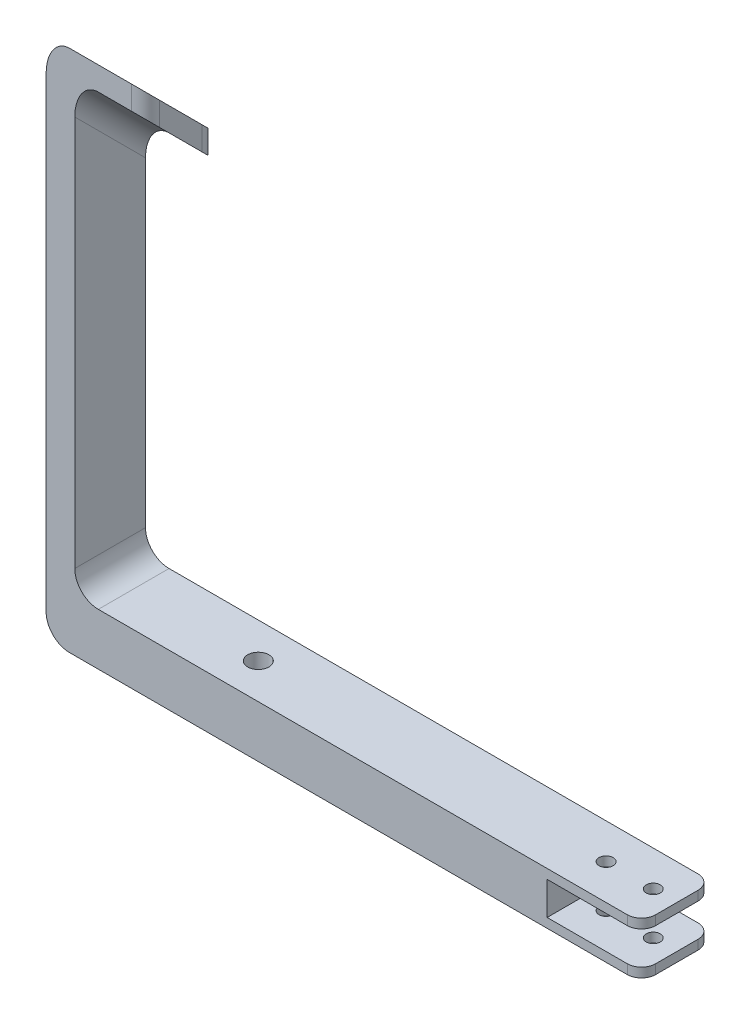
ISO-10303-21;
HEADER;
FILE_DESCRIPTION(('STEP AP214'),'2;1');
FILE_NAME('part.step','',(''),(''),'','','');
FILE_SCHEMA(('AUTOMOTIVE_DESIGN { 1 0 10303 214 1 1 1 1 }'));
ENDSEC;
DATA;
#1=APPLICATION_CONTEXT('core data for automotive mechanical design processes');
#2=APPLICATION_PROTOCOL_DEFINITION('international standard','automotive_design',2000,#1);
#3=PRODUCT_CONTEXT('',#1,'mechanical');
#4=PRODUCT('Part','Part','',(#3));
#5=PRODUCT_RELATED_PRODUCT_CATEGORY('part','',(#4));
#6=PRODUCT_DEFINITION_FORMATION('','',#4);
#7=PRODUCT_DEFINITION_CONTEXT('part definition',#1,'design');
#8=PRODUCT_DEFINITION('design','',#6,#7);
#9=PRODUCT_DEFINITION_SHAPE('','',#8);
#10=(LENGTH_UNIT() NAMED_UNIT(*) SI_UNIT(.MILLI.,.METRE.));
#11=(NAMED_UNIT(*) PLANE_ANGLE_UNIT() SI_UNIT($,.RADIAN.));
#12=(NAMED_UNIT(*) SI_UNIT($,.STERADIAN.) SOLID_ANGLE_UNIT());
#13=UNCERTAINTY_MEASURE_WITH_UNIT(LENGTH_MEASURE(1.E-05),#10,'distance_accuracy_value','');
#14=(GEOMETRIC_REPRESENTATION_CONTEXT(3) GLOBAL_UNCERTAINTY_ASSIGNED_CONTEXT((#13)) GLOBAL_UNIT_ASSIGNED_CONTEXT((#10,
#11,#12)) REPRESENTATION_CONTEXT('',''));
#15=CARTESIAN_POINT('',(0.,0.,0.));
#16=DIRECTION('',(0.,0.,1.));
#17=DIRECTION('',(1.,0.,0.));
#18=AXIS2_PLACEMENT_3D('',#15,#16,#17);
#19=CARTESIAN_POINT('',(-85.18,85.5,7.5));
#20=DIRECTION('',(-1.,0.,0.));
#21=DIRECTION('',(0.,0.,1.));
#22=AXIS2_PLACEMENT_3D('',#19,#20,#21);
#23=PLANE('',#22);
#24=DIRECTION('',(0.,0.707106781186544,0.707106781186551));
#25=VECTOR('',#24,1.);
#26=CARTESIAN_POINT('',(-85.18,93.,0.));
#27=LINE('',#26,#25);
#28=CARTESIAN_POINT('',(-85.18,88.5,-4.5));
#29=VERTEX_POINT('',#28);
#30=CARTESIAN_POINT('',(-85.18,97.4999999999999,4.5));
#31=VERTEX_POINT('',#30);
#32=EDGE_CURVE('E206',#29,#31,#27,.T.);
#33=ORIENTED_EDGE('',*,*,#32,.F.);
#34=DIRECTION('',(0.,1.,0.));
#35=VECTOR('',#34,1.);
#36=CARTESIAN_POINT('',(-85.18,105.5,-4.5));
#37=LINE('',#36,#35);
#38=CARTESIAN_POINT('',(-85.18,93.5,-4.5));
#39=VERTEX_POINT('',#38);
#40=EDGE_CURVE('E223',#29,#39,#37,.T.);
#41=ORIENTED_EDGE('',*,*,#40,.T.);
#42=DIRECTION('',(0.,-0.707106781186544,-0.707106781186552));
#43=VECTOR('',#42,1.);
#44=CARTESIAN_POINT('',(-85.18,95.5,-2.49999999999992));
#45=LINE('',#44,#43);
#46=CARTESIAN_POINT('',(-85.18,102.5,4.5));
#47=VERTEX_POINT('',#46);
#48=EDGE_CURVE('E200',#47,#39,#45,.T.);
#49=ORIENTED_EDGE('',*,*,#48,.F.);
#50=DIRECTION('',(0.,1.,0.));
#51=VECTOR('',#50,1.);
#52=CARTESIAN_POINT('',(-85.18,85.5,4.5));
#53=LINE('',#52,#51);
#54=EDGE_CURVE('E231',#47,#31,#53,.F.);
#55=ORIENTED_EDGE('',*,*,#54,.T.);
#56=EDGE_LOOP('',(#33,#41,#49,#55));
#57=FACE_BOUND('',#56,.T.);
#58=ADVANCED_FACE('F43',(#57),#23,.F.);
#59=CARTESIAN_POINT('',(0.,0.,7.5));
#60=DIRECTION('',(0.,0.,-1.));
#61=DIRECTION('',(-1.,0.,0.));
#62=AXIS2_PLACEMENT_3D('',#59,#60,#61);
#63=PLANE('',#62);
#64=DIRECTION('',(-1.,0.,0.));
#65=VECTOR('',#64,1.);
#66=CARTESIAN_POINT('',(-85.18,105.5,7.5));
#67=LINE('',#66,#65);
#68=CARTESIAN_POINT('',(-88.18,105.5,7.5));
#69=VERTEX_POINT('',#68);
#70=CARTESIAN_POINT('',(-101.25,105.5,7.5));
#71=VERTEX_POINT('',#70);
#72=EDGE_CURVE('E313',#69,#71,#67,.T.);
#73=ORIENTED_EDGE('',*,*,#72,.T.);
#74=CARTESIAN_POINT('',(-101.25,98.4289321881344,7.5));
#75=DIRECTION('',(0.,0.,-1.));
#76=DIRECTION('',(0.,1.,0.));
#77=AXIS2_PLACEMENT_3D('',#74,#75,#76);
#78=ELLIPSE('',#77,7.07106781186543,5.);
#79=CARTESIAN_POINT('',(-106.25,98.4289321881344,7.5));
#80=VERTEX_POINT('',#79);
#81=EDGE_CURVE('E265',#71,#80,#78,.F.);
#82=ORIENTED_EDGE('',*,*,#81,.T.);
#83=DIRECTION('',(0.,-1.,0.));
#84=VECTOR('',#83,1.);
#85=CARTESIAN_POINT('',(-106.25,105.5,7.5));
#86=LINE('',#85,#84);
#87=CARTESIAN_POINT('',(-106.25,-0.499999999999973,7.5));
#88=VERTEX_POINT('',#87);
#89=EDGE_CURVE('E320',#80,#88,#86,.T.);
#90=ORIENTED_EDGE('',*,*,#89,.T.);
#91=CARTESIAN_POINT('',(-101.25,-0.499999999999997,7.5));
#92=DIRECTION('',(0.,0.,-1.));
#93=DIRECTION('',(-1.,0.,0.));
#94=AXIS2_PLACEMENT_3D('',#91,#92,#93);
#95=CIRCLE('',#94,5.);
#96=CARTESIAN_POINT('',(-101.25,-5.5,7.5));
#97=VERTEX_POINT('',#96);
#98=EDGE_CURVE('E262',#88,#97,#95,.F.);
#99=ORIENTED_EDGE('',*,*,#98,.T.);
#100=DIRECTION('',(1.,0.,0.));
#101=VECTOR('',#100,1.);
#102=CARTESIAN_POINT('',(-106.25,-5.5,7.5));
#103=LINE('',#102,#101);
#104=CARTESIAN_POINT('',(17.,-5.5,7.5));
#105=VERTEX_POINT('',#104);
#106=EDGE_CURVE('E329',#97,#105,#103,.T.);
#107=ORIENTED_EDGE('',*,*,#106,.T.);
#108=DIRECTION('',(0.,1.,0.));
#109=VECTOR('',#108,1.);
#110=CARTESIAN_POINT('',(17.,0.,7.5));
#111=LINE('',#110,#109);
#112=CARTESIAN_POINT('',(17.,-3.5,7.5));
#113=VERTEX_POINT('',#112);
#114=EDGE_CURVE('E382',#105,#113,#111,.T.);
#115=ORIENTED_EDGE('',*,*,#114,.T.);
#116=DIRECTION('',(-1.,0.,0.));
#117=VECTOR('',#116,1.);
#118=CARTESIAN_POINT('',(20.,-3.5,7.5));
#119=LINE('',#118,#117);
#120=CARTESIAN_POINT('',(0.,-3.5,7.5));
#121=VERTEX_POINT('',#120);
#122=EDGE_CURVE('E355',#113,#121,#119,.T.);
#123=ORIENTED_EDGE('',*,*,#122,.T.);
#124=DIRECTION('',(0.,1.,0.));
#125=VECTOR('',#124,1.);
#126=CARTESIAN_POINT('',(0.,-3.5,7.5));
#127=LINE('',#126,#125);
#128=CARTESIAN_POINT('',(0.,3.5,7.5));
#129=VERTEX_POINT('',#128);
#130=EDGE_CURVE('E489',#121,#129,#127,.T.);
#131=ORIENTED_EDGE('',*,*,#130,.T.);
#132=DIRECTION('',(1.,0.,0.));
#133=VECTOR('',#132,1.);
#134=CARTESIAN_POINT('',(0.,3.5,7.5));
#135=LINE('',#134,#133);
#136=CARTESIAN_POINT('',(17.,3.5,7.5));
#137=VERTEX_POINT('',#136);
#138=EDGE_CURVE('E322',#129,#137,#135,.T.);
#139=ORIENTED_EDGE('',*,*,#138,.T.);
#140=DIRECTION('',(0.,1.,0.));
#141=VECTOR('',#140,1.);
#142=CARTESIAN_POINT('',(17.,0.,7.5));
#143=LINE('',#142,#141);
#144=CARTESIAN_POINT('',(17.,5.5,7.5));
#145=VERTEX_POINT('',#144);
#146=EDGE_CURVE('E378',#137,#145,#143,.T.);
#147=ORIENTED_EDGE('',*,*,#146,.T.);
#148=DIRECTION('',(-1.,0.,0.));
#149=VECTOR('',#148,1.);
#150=CARTESIAN_POINT('',(20.,5.5,7.5));
#151=LINE('',#150,#149);
#152=CARTESIAN_POINT('',(-95.18,5.49999999999999,7.5));
#153=VERTEX_POINT('',#152);
#154=EDGE_CURVE('E314',#145,#153,#151,.T.);
#155=ORIENTED_EDGE('',*,*,#154,.T.);
#156=CARTESIAN_POINT('',(-95.18,10.5,7.5));
#157=DIRECTION('',(0.,0.,-1.));
#158=DIRECTION('',(-1.,0.,0.));
#159=AXIS2_PLACEMENT_3D('',#156,#157,#158);
#160=CIRCLE('',#159,5.);
#161=CARTESIAN_POINT('',(-100.18,10.5,7.5));
#162=VERTEX_POINT('',#161);
#163=EDGE_CURVE('E12',#153,#162,#160,.T.);
#164=ORIENTED_EDGE('',*,*,#163,.T.);
#165=DIRECTION('',(0.,1.,0.));
#166=VECTOR('',#165,1.);
#167=CARTESIAN_POINT('',(-100.18,5.49999999999998,7.5));
#168=LINE('',#167,#166);
#169=CARTESIAN_POINT('',(-100.18,93.4289321881344,7.5));
#170=VERTEX_POINT('',#169);
#171=EDGE_CURVE('E311',#162,#170,#168,.T.);
#172=ORIENTED_EDGE('',*,*,#171,.T.);
#173=CARTESIAN_POINT('',(-95.18,93.4289321881344,7.5));
#174=DIRECTION('',(0.,0.,-1.));
#175=DIRECTION('',(0.,1.,0.));
#176=AXIS2_PLACEMENT_3D('',#173,#174,#175);
#177=ELLIPSE('',#176,7.07106781186544,5.);
#178=CARTESIAN_POINT('',(-95.18,100.5,7.5));
#179=VERTEX_POINT('',#178);
#180=EDGE_CURVE('E59',#170,#179,#177,.T.);
#181=ORIENTED_EDGE('',*,*,#180,.T.);
#182=DIRECTION('',(-1.,0.,0.));
#183=VECTOR('',#182,1.);
#184=CARTESIAN_POINT('',(20.,100.5,7.5));
#185=LINE('',#184,#183);
#186=CARTESIAN_POINT('',(-88.18,100.5,7.5));
#187=VERTEX_POINT('',#186);
#188=EDGE_CURVE('E216',#187,#179,#185,.T.);
#189=ORIENTED_EDGE('',*,*,#188,.F.);
#190=DIRECTION('',(0.,1.,0.));
#191=VECTOR('',#190,1.);
#192=CARTESIAN_POINT('',(-88.18,0.,7.5));
#193=LINE('',#192,#191);
#194=EDGE_CURVE('E222',#187,#69,#193,.T.);
#195=ORIENTED_EDGE('',*,*,#194,.T.);
#196=EDGE_LOOP('',(#73,#82,#90,#99,#107,#115,#123,#131,#139,#147,#155,#164,#172,#181,#189,#195));
#197=FACE_BOUND('',#196,.T.);
#198=ADVANCED_FACE('F443',(#197),#63,.F.);
#199=CARTESIAN_POINT('',(0.,0.,-7.5));
#200=DIRECTION('',(0.,0.,-1.));
#201=DIRECTION('',(-1.,0.,0.));
#202=AXIS2_PLACEMENT_3D('',#199,#200,#201);
#203=PLANE('',#202);
#204=DIRECTION('',(0.,-1.,0.));
#205=VECTOR('',#204,1.);
#206=CARTESIAN_POINT('',(-106.25,105.5,-7.5));
#207=LINE('',#206,#205);
#208=CARTESIAN_POINT('',(-106.25,83.4289321881346,-7.5));
#209=VERTEX_POINT('',#208);
#210=CARTESIAN_POINT('',(-106.25,-0.499999999999973,-7.5));
#211=VERTEX_POINT('',#210);
#212=EDGE_CURVE('E348',#209,#211,#207,.T.);
#213=ORIENTED_EDGE('',*,*,#212,.F.);
#214=CARTESIAN_POINT('',(-101.25,83.4289321881346,-7.5));
#215=DIRECTION('',(0.,0.,-1.));
#216=DIRECTION('',(0.,1.,0.));
#217=AXIS2_PLACEMENT_3D('',#214,#215,#216);
#218=ELLIPSE('',#217,7.07106781186543,5.);
#219=CARTESIAN_POINT('',(-101.25,90.5,-7.5));
#220=VERTEX_POINT('',#219);
#221=EDGE_CURVE('E214',#209,#220,#218,.T.);
#222=ORIENTED_EDGE('',*,*,#221,.T.);
#223=DIRECTION('',(-1.,0.,0.));
#224=VECTOR('',#223,1.);
#225=CARTESIAN_POINT('',(20.,90.5,-7.5));
#226=LINE('',#225,#224);
#227=CARTESIAN_POINT('',(-88.18,90.5,-7.5));
#228=VERTEX_POINT('',#227);
#229=EDGE_CURVE('E197',#228,#220,#226,.T.);
#230=ORIENTED_EDGE('',*,*,#229,.F.);
#231=DIRECTION('',(0.,1.,0.));
#232=VECTOR('',#231,1.);
#233=CARTESIAN_POINT('',(-88.18,85.5,-7.5));
#234=LINE('',#233,#232);
#235=CARTESIAN_POINT('',(-88.18,85.5,-7.5));
#236=VERTEX_POINT('',#235);
#237=EDGE_CURVE('E213',#228,#236,#234,.F.);
#238=ORIENTED_EDGE('',*,*,#237,.T.);
#239=DIRECTION('',(1.,0.,0.));
#240=VECTOR('',#239,1.);
#241=CARTESIAN_POINT('',(-100.18,85.5,-7.5));
#242=LINE('',#241,#240);
#243=CARTESIAN_POINT('',(-95.18,85.5,-7.5));
#244=VERTEX_POINT('',#243);
#245=EDGE_CURVE('E345',#244,#236,#242,.T.);
#246=ORIENTED_EDGE('',*,*,#245,.F.);
#247=CARTESIAN_POINT('',(-95.18,78.4289321881345,-7.5));
#248=DIRECTION('',(0.,0.,-1.));
#249=DIRECTION('',(0.,1.,0.));
#250=AXIS2_PLACEMENT_3D('',#247,#248,#249);
#251=ELLIPSE('',#250,7.07106781186544,5.);
#252=CARTESIAN_POINT('',(-100.18,78.4289321881345,-7.5));
#253=VERTEX_POINT('',#252);
#254=EDGE_CURVE('E287',#244,#253,#251,.F.);
#255=ORIENTED_EDGE('',*,*,#254,.T.);
#256=DIRECTION('',(0.,1.,0.));
#257=VECTOR('',#256,1.);
#258=CARTESIAN_POINT('',(-100.18,5.49999999999998,-7.5));
#259=LINE('',#258,#257);
#260=CARTESIAN_POINT('',(-100.18,10.5,-7.5));
#261=VERTEX_POINT('',#260);
#262=EDGE_CURVE('E297',#261,#253,#259,.T.);
#263=ORIENTED_EDGE('',*,*,#262,.F.);
#264=CARTESIAN_POINT('',(-95.18,10.5,-7.5));
#265=DIRECTION('',(0.,0.,-1.));
#266=DIRECTION('',(-1.,0.,0.));
#267=AXIS2_PLACEMENT_3D('',#264,#265,#266);
#268=CIRCLE('',#267,5.);
#269=CARTESIAN_POINT('',(-95.18,5.49999999999999,-7.5));
#270=VERTEX_POINT('',#269);
#271=EDGE_CURVE('E52',#261,#270,#268,.F.);
#272=ORIENTED_EDGE('',*,*,#271,.T.);
#273=DIRECTION('',(-1.,0.,0.));
#274=VECTOR('',#273,1.);
#275=CARTESIAN_POINT('',(20.,5.5,-7.5));
#276=LINE('',#275,#274);
#277=CARTESIAN_POINT('',(17.,5.5,-7.5));
#278=VERTEX_POINT('',#277);
#279=EDGE_CURVE('E294',#278,#270,#276,.T.);
#280=ORIENTED_EDGE('',*,*,#279,.F.);
#281=DIRECTION('',(0.,1.,0.));
#282=VECTOR('',#281,1.);
#283=CARTESIAN_POINT('',(17.,3.5,-7.5));
#284=LINE('',#283,#282);
#285=CARTESIAN_POINT('',(17.,3.5,-7.5));
#286=VERTEX_POINT('',#285);
#287=EDGE_CURVE('E406',#278,#286,#284,.F.);
#288=ORIENTED_EDGE('',*,*,#287,.T.);
#289=DIRECTION('',(1.,0.,0.));
#290=VECTOR('',#289,1.);
#291=CARTESIAN_POINT('',(0.,3.5,-7.5));
#292=LINE('',#291,#290);
#293=CARTESIAN_POINT('',(0.,3.5,-7.5));
#294=VERTEX_POINT('',#293);
#295=EDGE_CURVE('E307',#294,#286,#292,.T.);
#296=ORIENTED_EDGE('',*,*,#295,.F.);
#297=DIRECTION('',(0.,1.,0.));
#298=VECTOR('',#297,1.);
#299=CARTESIAN_POINT('',(0.,-3.5,-7.5));
#300=LINE('',#299,#298);
#301=CARTESIAN_POINT('',(0.,-3.5,-7.5));
#302=VERTEX_POINT('',#301);
#303=EDGE_CURVE('E336',#302,#294,#300,.T.);
#304=ORIENTED_EDGE('',*,*,#303,.F.);
#305=DIRECTION('',(-1.,0.,0.));
#306=VECTOR('',#305,1.);
#307=CARTESIAN_POINT('',(20.,-3.5,-7.5));
#308=LINE('',#307,#306);
#309=CARTESIAN_POINT('',(17.,-3.5,-7.5));
#310=VERTEX_POINT('',#309);
#311=EDGE_CURVE('E333',#310,#302,#308,.T.);
#312=ORIENTED_EDGE('',*,*,#311,.F.);
#313=DIRECTION('',(0.,1.,0.));
#314=VECTOR('',#313,1.);
#315=CARTESIAN_POINT('',(17.,-5.5,-7.5));
#316=LINE('',#315,#314);
#317=CARTESIAN_POINT('',(17.,-5.5,-7.5));
#318=VERTEX_POINT('',#317);
#319=EDGE_CURVE('E409',#310,#318,#316,.F.);
#320=ORIENTED_EDGE('',*,*,#319,.T.);
#321=DIRECTION('',(1.,0.,0.));
#322=VECTOR('',#321,1.);
#323=CARTESIAN_POINT('',(-106.25,-5.5,-7.5));
#324=LINE('',#323,#322);
#325=CARTESIAN_POINT('',(-101.25,-5.5,-7.5));
#326=VERTEX_POINT('',#325);
#327=EDGE_CURVE('E352',#326,#318,#324,.T.);
#328=ORIENTED_EDGE('',*,*,#327,.F.);
#329=CARTESIAN_POINT('',(-101.25,-0.499999999999997,-7.5));
#330=DIRECTION('',(0.,0.,-1.));
#331=DIRECTION('',(-1.,0.,0.));
#332=AXIS2_PLACEMENT_3D('',#329,#330,#331);
#333=CIRCLE('',#332,5.);
#334=EDGE_CURVE('E254',#326,#211,#333,.T.);
#335=ORIENTED_EDGE('',*,*,#334,.T.);
#336=EDGE_LOOP('',(#213,#222,#230,#238,#246,#255,#263,#272,#280,#288,#296,#304,#312,#320,#328,#335));
#337=FACE_BOUND('',#336,.T.);
#338=ADVANCED_FACE('F211',(#337),#203,.T.);
#339=CARTESIAN_POINT('',(-88.18,85.5,-4.5));
#340=DIRECTION('',(0.,-1.,0.));
#341=DIRECTION('',(0.,0.,-1.));
#342=AXIS2_PLACEMENT_3D('',#339,#340,#341);
#343=CYLINDRICAL_SURFACE('',#342,3.);
#344=ORIENTED_EDGE('',*,*,#40,.F.);
#345=CARTESIAN_POINT('',(-88.18,88.5,-4.5));
#346=DIRECTION('',(0.,-0.707106781186551,0.707106781186544));
#347=DIRECTION('',(0.,-0.707106781186544,-0.707106781186551));
#348=AXIS2_PLACEMENT_3D('',#345,#346,#347);
#349=ELLIPSE('',#348,4.24264068711926,3.);
#350=EDGE_CURVE('E220',#29,#236,#349,.F.);
#351=ORIENTED_EDGE('',*,*,#350,.T.);
#352=ORIENTED_EDGE('',*,*,#237,.F.);
#353=CARTESIAN_POINT('',(-88.18,93.5,-4.5));
#354=DIRECTION('',(0.,0.707106781186552,-0.707106781186544));
#355=DIRECTION('',(0.,-0.707106781186544,-0.707106781186552));
#356=AXIS2_PLACEMENT_3D('',#353,#354,#355);
#357=ELLIPSE('',#356,4.24264068711926,3.);
#358=EDGE_CURVE('E194',#228,#39,#357,.F.);
#359=ORIENTED_EDGE('',*,*,#358,.T.);
#360=EDGE_LOOP('',(#344,#351,#352,#359));
#361=FACE_BOUND('',#360,.T.);
#362=ADVANCED_FACE('F219',(#361),#343,.T.);
#363=CARTESIAN_POINT('',(-88.18,0.,4.5));
#364=DIRECTION('',(0.,1.,0.));
#365=DIRECTION('',(0.,0.,1.));
#366=AXIS2_PLACEMENT_3D('',#363,#364,#365);
#367=CYLINDRICAL_SURFACE('',#366,3.);
#368=ORIENTED_EDGE('',*,*,#194,.F.);
#369=CARTESIAN_POINT('',(-88.18,97.4999999999999,4.5));
#370=DIRECTION('',(0.,-0.707106781186551,0.707106781186544));
#371=DIRECTION('',(0.,0.707106781186544,0.707106781186551));
#372=AXIS2_PLACEMENT_3D('',#369,#370,#371);
#373=ELLIPSE('',#372,4.24264068711926,3.);
#374=EDGE_CURVE('E238',#187,#31,#373,.F.);
#375=ORIENTED_EDGE('',*,*,#374,.T.);
#376=ORIENTED_EDGE('',*,*,#54,.F.);
#377=CARTESIAN_POINT('',(-88.18,102.5,4.5));
#378=DIRECTION('',(0.,0.707106781186552,-0.707106781186544));
#379=DIRECTION('',(0.,0.707106781186544,0.707106781186552));
#380=AXIS2_PLACEMENT_3D('',#377,#378,#379);
#381=ELLIPSE('',#380,4.24264068711926,3.);
#382=EDGE_CURVE('E229',#47,#69,#381,.F.);
#383=ORIENTED_EDGE('',*,*,#382,.T.);
#384=EDGE_LOOP('',(#368,#375,#376,#383));
#385=FACE_BOUND('',#384,.T.);
#386=ADVANCED_FACE('F438',(#385),#367,.T.);
#387=CARTESIAN_POINT('',(20.,-3.5,7.5));
#388=DIRECTION('',(0.,-1.,0.));
#389=DIRECTION('',(1.,0.,0.));
#390=AXIS2_PLACEMENT_3D('',#387,#388,#389);
#391=PLANE('',#390);
#392=CARTESIAN_POINT('',(15.,-3.5,0.));
#393=DIRECTION('',(0.,-1.,0.));
#394=DIRECTION('',(1.,0.,0.));
#395=AXIS2_PLACEMENT_3D('',#392,#393,#394);
#396=CIRCLE('',#395,1.5);
#397=CARTESIAN_POINT('',(16.5,-3.5,0.));
#398=VERTEX_POINT('',#397);
#399=EDGE_CURVE('E337',#398,#398,#396,.T.);
#400=ORIENTED_EDGE('',*,*,#399,.T.);
#401=EDGE_LOOP('',(#400));
#402=FACE_BOUND('',#401,.T.);
#403=CARTESIAN_POINT('',(5.,-3.5,0.));
#404=DIRECTION('',(0.,-1.,0.));
#405=DIRECTION('',(1.,0.,0.));
#406=AXIS2_PLACEMENT_3D('',#403,#404,#405);
#407=CIRCLE('',#406,1.5);
#408=CARTESIAN_POINT('',(6.5,-3.5,0.));
#409=VERTEX_POINT('',#408);
#410=EDGE_CURVE('E476',#409,#409,#407,.T.);
#411=ORIENTED_EDGE('',*,*,#410,.T.);
#412=EDGE_LOOP('',(#411));
#413=FACE_BOUND('',#412,.T.);
#414=ORIENTED_EDGE('',*,*,#122,.F.);
#415=CARTESIAN_POINT('',(17.,-3.5,4.5));
#416=DIRECTION('',(0.,-1.,0.));
#417=DIRECTION('',(1.,0.,0.));
#418=AXIS2_PLACEMENT_3D('',#415,#416,#417);
#419=CIRCLE('',#418,3.);
#420=CARTESIAN_POINT('',(20.,-3.5,4.5));
#421=VERTEX_POINT('',#420);
#422=EDGE_CURVE('E389',#113,#421,#419,.F.);
#423=ORIENTED_EDGE('',*,*,#422,.T.);
#424=DIRECTION('',(0.,0.,-1.));
#425=VECTOR('',#424,1.);
#426=CARTESIAN_POINT('',(20.,-3.5,7.5));
#427=LINE('',#426,#425);
#428=CARTESIAN_POINT('',(20.,-3.5,-4.5));
#429=VERTEX_POINT('',#428);
#430=EDGE_CURVE('E332',#421,#429,#427,.T.);
#431=ORIENTED_EDGE('',*,*,#430,.T.);
#432=CARTESIAN_POINT('',(17.,-3.5,-4.5));
#433=DIRECTION('',(0.,-1.,0.));
#434=DIRECTION('',(1.,0.,0.));
#435=AXIS2_PLACEMENT_3D('',#432,#433,#434);
#436=CIRCLE('',#435,3.);
#437=EDGE_CURVE('E386',#429,#310,#436,.F.);
#438=ORIENTED_EDGE('',*,*,#437,.T.);
#439=ORIENTED_EDGE('',*,*,#311,.T.);
#440=DIRECTION('',(0.,0.,-1.));
#441=VECTOR('',#440,1.);
#442=CARTESIAN_POINT('',(0.,-3.5,7.5));
#443=LINE('',#442,#441);
#444=EDGE_CURVE('E374',#121,#302,#443,.T.);
#445=ORIENTED_EDGE('',*,*,#444,.F.);
#446=EDGE_LOOP('',(#414,#423,#431,#438,#439,#445));
#447=FACE_BOUND('',#446,.T.);
#448=ADVANCED_FACE('F585',(#402,#413,#447),#391,.F.);
#449=CARTESIAN_POINT('',(0.,-3.5,7.5));
#450=DIRECTION('',(-1.,0.,0.));
#451=DIRECTION('',(0.,0.,1.));
#452=AXIS2_PLACEMENT_3D('',#449,#450,#451);
#453=PLANE('',#452);
#454=ORIENTED_EDGE('',*,*,#303,.T.);
#455=DIRECTION('',(0.,0.,-1.));
#456=VECTOR('',#455,1.);
#457=CARTESIAN_POINT('',(0.,3.5,7.5));
#458=LINE('',#457,#456);
#459=EDGE_CURVE('E370',#129,#294,#458,.T.);
#460=ORIENTED_EDGE('',*,*,#459,.F.);
#461=ORIENTED_EDGE('',*,*,#130,.F.);
#462=ORIENTED_EDGE('',*,*,#444,.T.);
#463=EDGE_LOOP('',(#454,#460,#461,#462));
#464=FACE_BOUND('',#463,.T.);
#465=ADVANCED_FACE('F515',(#464),#453,.F.);
#466=CARTESIAN_POINT('',(0.,3.5,7.5));
#467=DIRECTION('',(0.,1.,0.));
#468=DIRECTION('',(0.,0.,1.));
#469=AXIS2_PLACEMENT_3D('',#466,#467,#468);
#470=PLANE('',#469);
#471=CARTESIAN_POINT('',(15.,3.5,0.));
#472=DIRECTION('',(0.,1.,0.));
#473=DIRECTION('',(0.,0.,1.));
#474=AXIS2_PLACEMENT_3D('',#471,#472,#473);
#475=CIRCLE('',#474,1.5);
#476=CARTESIAN_POINT('',(15.,3.5,1.5));
#477=VERTEX_POINT('',#476);
#478=EDGE_CURVE('E480',#477,#477,#475,.T.);
#479=ORIENTED_EDGE('',*,*,#478,.T.);
#480=EDGE_LOOP('',(#479));
#481=FACE_BOUND('',#480,.T.);
#482=CARTESIAN_POINT('',(5.,3.5,0.));
#483=DIRECTION('',(0.,1.,0.));
#484=DIRECTION('',(0.,0.,1.));
#485=AXIS2_PLACEMENT_3D('',#482,#483,#484);
#486=CIRCLE('',#485,1.5);
#487=CARTESIAN_POINT('',(5.,3.5,1.5));
#488=VERTEX_POINT('',#487);
#489=EDGE_CURVE('E461',#488,#488,#486,.T.);
#490=ORIENTED_EDGE('',*,*,#489,.T.);
#491=EDGE_LOOP('',(#490));
#492=FACE_BOUND('',#491,.T.);
#493=DIRECTION('',(0.,0.,-1.));
#494=VECTOR('',#493,1.);
#495=CARTESIAN_POINT('',(20.,3.5,7.5));
#496=LINE('',#495,#494);
#497=CARTESIAN_POINT('',(20.,3.5,4.5));
#498=VERTEX_POINT('',#497);
#499=CARTESIAN_POINT('',(20.,3.5,-4.5));
#500=VERTEX_POINT('',#499);
#501=EDGE_CURVE('E366',#498,#500,#496,.T.);
#502=ORIENTED_EDGE('',*,*,#501,.F.);
#503=CARTESIAN_POINT('',(17.,3.5,4.5));
#504=DIRECTION('',(0.,1.,0.));
#505=DIRECTION('',(0.,0.,1.));
#506=AXIS2_PLACEMENT_3D('',#503,#504,#505);
#507=CIRCLE('',#506,3.);
#508=EDGE_CURVE('E428',#498,#137,#507,.F.);
#509=ORIENTED_EDGE('',*,*,#508,.T.);
#510=ORIENTED_EDGE('',*,*,#138,.F.);
#511=ORIENTED_EDGE('',*,*,#459,.T.);
#512=ORIENTED_EDGE('',*,*,#295,.T.);
#513=CARTESIAN_POINT('',(17.,3.5,-4.5));
#514=DIRECTION('',(0.,1.,0.));
#515=DIRECTION('',(0.,0.,1.));
#516=AXIS2_PLACEMENT_3D('',#513,#514,#515);
#517=CIRCLE('',#516,3.);
#518=EDGE_CURVE('E425',#286,#500,#517,.F.);
#519=ORIENTED_EDGE('',*,*,#518,.T.);
#520=EDGE_LOOP('',(#502,#509,#510,#511,#512,#519));
#521=FACE_BOUND('',#520,.T.);
#522=ADVANCED_FACE('F513',(#481,#492,#521),#470,.F.);
#523=CARTESIAN_POINT('',(20.,3.5,7.5));
#524=DIRECTION('',(-1.,0.,0.));
#525=DIRECTION('',(0.,-1.,0.));
#526=AXIS2_PLACEMENT_3D('',#523,#524,#525);
#527=PLANE('',#526);
#528=DIRECTION('',(0.,0.,-1.));
#529=VECTOR('',#528,1.);
#530=CARTESIAN_POINT('',(20.,5.5,7.5));
#531=LINE('',#530,#529);
#532=CARTESIAN_POINT('',(20.,5.5,4.5));
#533=VERTEX_POINT('',#532);
#534=CARTESIAN_POINT('',(20.,5.5,-4.5));
#535=VERTEX_POINT('',#534);
#536=EDGE_CURVE('E363',#533,#535,#531,.T.);
#537=ORIENTED_EDGE('',*,*,#536,.F.);
#538=DIRECTION('',(0.,1.,0.));
#539=VECTOR('',#538,1.);
#540=CARTESIAN_POINT('',(20.,3.5,4.5));
#541=LINE('',#540,#539);
#542=EDGE_CURVE('E422',#533,#498,#541,.F.);
#543=ORIENTED_EDGE('',*,*,#542,.T.);
#544=ORIENTED_EDGE('',*,*,#501,.T.);
#545=DIRECTION('',(0.,1.,0.));
#546=VECTOR('',#545,1.);
#547=CARTESIAN_POINT('',(20.,5.5,-4.5));
#548=LINE('',#547,#546);
#549=EDGE_CURVE('E418',#500,#535,#548,.T.);
#550=ORIENTED_EDGE('',*,*,#549,.T.);
#551=EDGE_LOOP('',(#537,#543,#544,#550));
#552=FACE_BOUND('',#551,.T.);
#553=ADVANCED_FACE('F505',(#552),#527,.F.);
#554=CARTESIAN_POINT('',(20.,5.5,7.5));
#555=DIRECTION('',(0.,-1.,0.));
#556=DIRECTION('',(1.,0.,0.));
#557=AXIS2_PLACEMENT_3D('',#554,#555,#556);
#558=PLANE('',#557);
#559=CARTESIAN_POINT('',(-68.75,5.49999999999999,0.));
#560=DIRECTION('',(0.,1.,0.));
#561=DIRECTION('',(-1.,0.,0.));
#562=AXIS2_PLACEMENT_3D('',#559,#560,#561);
#563=CIRCLE('',#562,2.25);
#564=CARTESIAN_POINT('',(-71.,5.49999999999999,0.));
#565=VERTEX_POINT('',#564);
#566=EDGE_CURVE('E825',#565,#565,#563,.T.);
#567=ORIENTED_EDGE('',*,*,#566,.F.);
#568=EDGE_LOOP('',(#567));
#569=FACE_BOUND('',#568,.T.);
#570=CARTESIAN_POINT('',(15.,5.5,0.));
#571=DIRECTION('',(0.,1.,0.));
#572=DIRECTION('',(-1.,0.,0.));
#573=AXIS2_PLACEMENT_3D('',#570,#571,#572);
#574=CIRCLE('',#573,1.5);
#575=CARTESIAN_POINT('',(13.5,5.5,0.));
#576=VERTEX_POINT('',#575);
#577=EDGE_CURVE('E462',#576,#576,#574,.T.);
#578=ORIENTED_EDGE('',*,*,#577,.F.);
#579=EDGE_LOOP('',(#578));
#580=FACE_BOUND('',#579,.T.);
#581=CARTESIAN_POINT('',(5.,5.5,0.));
#582=DIRECTION('',(0.,1.,0.));
#583=DIRECTION('',(-1.,0.,0.));
#584=AXIS2_PLACEMENT_3D('',#581,#582,#583);
#585=CIRCLE('',#584,1.5);
#586=CARTESIAN_POINT('',(3.5,5.5,0.));
#587=VERTEX_POINT('',#586);
#588=EDGE_CURVE('E466',#587,#587,#585,.T.);
#589=ORIENTED_EDGE('',*,*,#588,.F.);
#590=EDGE_LOOP('',(#589));
#591=FACE_BOUND('',#590,.T.);
#592=ORIENTED_EDGE('',*,*,#279,.T.);
#593=DIRECTION('',(0.,0.,-1.));
#594=VECTOR('',#593,1.);
#595=CARTESIAN_POINT('',(-95.18,5.49999999999999,7.5));
#596=LINE('',#595,#594);
#597=EDGE_CURVE('E282',#270,#153,#596,.F.);
#598=ORIENTED_EDGE('',*,*,#597,.T.);
#599=ORIENTED_EDGE('',*,*,#154,.F.);
#600=CARTESIAN_POINT('',(17.,5.5,4.5));
#601=DIRECTION('',(0.,-1.,0.));
#602=DIRECTION('',(1.,0.,0.));
#603=AXIS2_PLACEMENT_3D('',#600,#601,#602);
#604=CIRCLE('',#603,3.);
#605=EDGE_CURVE('E415',#145,#533,#604,.F.);
#606=ORIENTED_EDGE('',*,*,#605,.T.);
#607=ORIENTED_EDGE('',*,*,#536,.T.);
#608=CARTESIAN_POINT('',(17.,5.5,-4.5));
#609=DIRECTION('',(0.,-1.,0.));
#610=DIRECTION('',(1.,0.,0.));
#611=AXIS2_PLACEMENT_3D('',#608,#609,#610);
#612=CIRCLE('',#611,3.);
#613=EDGE_CURVE('E305',#535,#278,#612,.F.);
#614=ORIENTED_EDGE('',*,*,#613,.T.);
#615=EDGE_LOOP('',(#592,#598,#599,#606,#607,#614));
#616=FACE_BOUND('',#615,.T.);
#617=ADVANCED_FACE('F302',(#569,#580,#591,#616),#558,.F.);
#618=CARTESIAN_POINT('',(-100.18,5.49999999999998,7.5));
#619=DIRECTION('',(-1.,0.,0.));
#620=DIRECTION('',(0.,0.,1.));
#621=AXIS2_PLACEMENT_3D('',#618,#619,#620);
#622=PLANE('',#621);
#623=ORIENTED_EDGE('',*,*,#262,.T.);
#624=DIRECTION('',(0.,0.707106781186544,0.707106781186551));
#625=VECTOR('',#624,1.);
#626=CARTESIAN_POINT('',(-100.18,49.4644660940677,-36.4644660940672));
#627=LINE('',#626,#625);
#628=EDGE_CURVE('E272',#253,#170,#627,.T.);
#629=ORIENTED_EDGE('',*,*,#628,.T.);
#630=ORIENTED_EDGE('',*,*,#171,.F.);
#631=DIRECTION('',(0.,0.,-1.));
#632=VECTOR('',#631,1.);
#633=CARTESIAN_POINT('',(-100.18,10.5,-7.5));
#634=LINE('',#633,#632);
#635=EDGE_CURVE('E268',#162,#261,#634,.T.);
#636=ORIENTED_EDGE('',*,*,#635,.T.);
#637=EDGE_LOOP('',(#623,#629,#630,#636));
#638=FACE_BOUND('',#637,.T.);
#639=ADVANCED_FACE('F310',(#638),#622,.F.);
#640=CARTESIAN_POINT('',(-106.25,105.5,7.5));
#641=DIRECTION('',(1.,0.,0.));
#642=DIRECTION('',(0.,1.,0.));
#643=AXIS2_PLACEMENT_3D('',#640,#641,#642);
#644=PLANE('',#643);
#645=ORIENTED_EDGE('',*,*,#89,.F.);
#646=DIRECTION('',(0.,-0.707106781186544,-0.707106781186552));
#647=VECTOR('',#646,1.);
#648=CARTESIAN_POINT('',(-106.25,86.9644660940672,-3.96446609406729));
#649=LINE('',#648,#647);
#650=EDGE_CURVE('E250',#80,#209,#649,.T.);
#651=ORIENTED_EDGE('',*,*,#650,.T.);
#652=ORIENTED_EDGE('',*,*,#212,.T.);
#653=DIRECTION('',(0.,0.,-1.));
#654=VECTOR('',#653,1.);
#655=CARTESIAN_POINT('',(-106.25,-0.5,7.5));
#656=LINE('',#655,#654);
#657=EDGE_CURVE('E242',#211,#88,#656,.F.);
#658=ORIENTED_EDGE('',*,*,#657,.T.);
#659=EDGE_LOOP('',(#645,#651,#652,#658));
#660=FACE_BOUND('',#659,.T.);
#661=ADVANCED_FACE('F544',(#660),#644,.F.);
#662=CARTESIAN_POINT('',(-106.25,-5.5,7.5));
#663=DIRECTION('',(0.,1.,0.));
#664=DIRECTION('',(0.,0.,1.));
#665=AXIS2_PLACEMENT_3D('',#662,#663,#664);
#666=PLANE('',#665);
#667=CARTESIAN_POINT('',(15.,-5.5,0.));
#668=DIRECTION('',(0.,1.,0.));
#669=DIRECTION('',(-1.,0.,0.));
#670=AXIS2_PLACEMENT_3D('',#667,#668,#669);
#671=CIRCLE('',#670,1.5);
#672=CARTESIAN_POINT('',(13.5,-5.5,0.));
#673=VERTEX_POINT('',#672);
#674=EDGE_CURVE('E457',#673,#673,#671,.T.);
#675=ORIENTED_EDGE('',*,*,#674,.T.);
#676=EDGE_LOOP('',(#675));
#677=FACE_BOUND('',#676,.T.);
#678=CARTESIAN_POINT('',(5.,-5.5,0.));
#679=DIRECTION('',(0.,1.,0.));
#680=DIRECTION('',(-1.,0.,0.));
#681=AXIS2_PLACEMENT_3D('',#678,#679,#680);
#682=CIRCLE('',#681,1.5);
#683=CARTESIAN_POINT('',(3.5,-5.5,0.));
#684=VERTEX_POINT('',#683);
#685=EDGE_CURVE('E456',#684,#684,#682,.T.);
#686=ORIENTED_EDGE('',*,*,#685,.T.);
#687=EDGE_LOOP('',(#686));
#688=FACE_BOUND('',#687,.T.);
#689=ORIENTED_EDGE('',*,*,#106,.F.);
#690=DIRECTION('',(0.,0.,-1.));
#691=VECTOR('',#690,1.);
#692=CARTESIAN_POINT('',(-101.25,-5.5,7.5));
#693=LINE('',#692,#691);
#694=EDGE_CURVE('E278',#97,#326,#693,.T.);
#695=ORIENTED_EDGE('',*,*,#694,.T.);
#696=ORIENTED_EDGE('',*,*,#327,.T.);
#697=CARTESIAN_POINT('',(17.,-5.5,-4.5));
#698=DIRECTION('',(0.,1.,0.));
#699=DIRECTION('',(0.,0.,1.));
#700=AXIS2_PLACEMENT_3D('',#697,#698,#699);
#701=CIRCLE('',#700,3.);
#702=CARTESIAN_POINT('',(20.,-5.5,-4.5));
#703=VERTEX_POINT('',#702);
#704=EDGE_CURVE('E399',#318,#703,#701,.F.);
#705=ORIENTED_EDGE('',*,*,#704,.T.);
#706=DIRECTION('',(0.,0.,-1.));
#707=VECTOR('',#706,1.);
#708=CARTESIAN_POINT('',(20.,-5.5,7.5));
#709=LINE('',#708,#707);
#710=CARTESIAN_POINT('',(20.,-5.5,4.5));
#711=VERTEX_POINT('',#710);
#712=EDGE_CURVE('E359',#711,#703,#709,.T.);
#713=ORIENTED_EDGE('',*,*,#712,.F.);
#714=CARTESIAN_POINT('',(17.,-5.5,4.5));
#715=DIRECTION('',(0.,1.,0.));
#716=DIRECTION('',(0.,0.,1.));
#717=AXIS2_PLACEMENT_3D('',#714,#715,#716);
#718=CIRCLE('',#717,3.);
#719=EDGE_CURVE('E402',#711,#105,#718,.F.);
#720=ORIENTED_EDGE('',*,*,#719,.T.);
#721=EDGE_LOOP('',(#689,#695,#696,#705,#713,#720));
#722=FACE_BOUND('',#721,.T.);
#723=ADVANCED_FACE('F528',(#677,#688,#722),#666,.F.);
#724=CARTESIAN_POINT('',(20.,-5.5,7.5));
#725=DIRECTION('',(-1.,0.,0.));
#726=DIRECTION('',(0.,0.,1.));
#727=AXIS2_PLACEMENT_3D('',#724,#725,#726);
#728=PLANE('',#727);
#729=ORIENTED_EDGE('',*,*,#430,.F.);
#730=DIRECTION('',(0.,1.,0.));
#731=VECTOR('',#730,1.);
#732=CARTESIAN_POINT('',(20.,-5.5,4.5));
#733=LINE('',#732,#731);
#734=EDGE_CURVE('E396',#421,#711,#733,.F.);
#735=ORIENTED_EDGE('',*,*,#734,.T.);
#736=ORIENTED_EDGE('',*,*,#712,.T.);
#737=DIRECTION('',(0.,1.,0.));
#738=VECTOR('',#737,1.);
#739=CARTESIAN_POINT('',(20.,-3.5,-4.5));
#740=LINE('',#739,#738);
#741=EDGE_CURVE('E392',#703,#429,#740,.T.);
#742=ORIENTED_EDGE('',*,*,#741,.T.);
#743=EDGE_LOOP('',(#729,#735,#736,#742));
#744=FACE_BOUND('',#743,.T.);
#745=ADVANCED_FACE('F532',(#744),#728,.F.);
#746=CARTESIAN_POINT('',(5.,-5.5,0.));
#747=DIRECTION('',(0.,1.,0.));
#748=DIRECTION('',(-1.,0.,0.));
#749=AXIS2_PLACEMENT_3D('',#746,#747,#748);
#750=CYLINDRICAL_SURFACE('',#749,1.5);
#751=ORIENTED_EDGE('',*,*,#685,.F.);
#752=EDGE_LOOP('',(#751));
#753=FACE_BOUND('',#752,.T.);
#754=ORIENTED_EDGE('',*,*,#410,.F.);
#755=EDGE_LOOP('',(#754));
#756=FACE_BOUND('',#755,.T.);
#757=ADVANCED_FACE('F709',(#753,#756),#750,.F.);
#758=CARTESIAN_POINT('',(15.,-5.5,0.));
#759=DIRECTION('',(0.,1.,0.));
#760=DIRECTION('',(-1.,0.,0.));
#761=AXIS2_PLACEMENT_3D('',#758,#759,#760);
#762=CYLINDRICAL_SURFACE('',#761,1.5);
#763=ORIENTED_EDGE('',*,*,#674,.F.);
#764=EDGE_LOOP('',(#763));
#765=FACE_BOUND('',#764,.T.);
#766=ORIENTED_EDGE('',*,*,#399,.F.);
#767=EDGE_LOOP('',(#766));
#768=FACE_BOUND('',#767,.T.);
#769=ADVANCED_FACE('F700',(#765,#768),#762,.F.);
#770=ORIENTED_EDGE('',*,*,#588,.T.);
#771=EDGE_LOOP('',(#770));
#772=FACE_BOUND('',#771,.T.);
#773=ORIENTED_EDGE('',*,*,#489,.F.);
#774=EDGE_LOOP('',(#773));
#775=FACE_BOUND('',#774,.T.);
#776=ADVANCED_FACE('F697',(#772,#775),#750,.F.);
#777=ORIENTED_EDGE('',*,*,#577,.T.);
#778=EDGE_LOOP('',(#777));
#779=FACE_BOUND('',#778,.T.);
#780=ORIENTED_EDGE('',*,*,#478,.F.);
#781=EDGE_LOOP('',(#780));
#782=FACE_BOUND('',#781,.T.);
#783=ADVANCED_FACE('F591',(#779,#782),#762,.F.);
#784=CARTESIAN_POINT('',(17.,0.,4.5));
#785=DIRECTION('',(0.,1.,0.));
#786=DIRECTION('',(0.,0.,1.));
#787=AXIS2_PLACEMENT_3D('',#784,#785,#786);
#788=CYLINDRICAL_SURFACE('',#787,3.);
#789=ORIENTED_EDGE('',*,*,#719,.F.);
#790=ORIENTED_EDGE('',*,*,#734,.F.);
#791=ORIENTED_EDGE('',*,*,#422,.F.);
#792=ORIENTED_EDGE('',*,*,#114,.F.);
#793=EDGE_LOOP('',(#789,#790,#791,#792));
#794=FACE_BOUND('',#793,.T.);
#795=ADVANCED_FACE('F535',(#794),#788,.T.);
#796=CARTESIAN_POINT('',(17.,-5.5,-4.5));
#797=DIRECTION('',(0.,-1.,0.));
#798=DIRECTION('',(0.,0.,-1.));
#799=AXIS2_PLACEMENT_3D('',#796,#797,#798);
#800=CYLINDRICAL_SURFACE('',#799,3.);
#801=ORIENTED_EDGE('',*,*,#704,.F.);
#802=ORIENTED_EDGE('',*,*,#319,.F.);
#803=ORIENTED_EDGE('',*,*,#437,.F.);
#804=ORIENTED_EDGE('',*,*,#741,.F.);
#805=EDGE_LOOP('',(#801,#802,#803,#804));
#806=FACE_BOUND('',#805,.T.);
#807=ADVANCED_FACE('F523',(#806),#800,.T.);
#808=CARTESIAN_POINT('',(17.,0.,4.5));
#809=DIRECTION('',(0.,1.,0.));
#810=DIRECTION('',(-1.,0.,0.));
#811=AXIS2_PLACEMENT_3D('',#808,#809,#810);
#812=CYLINDRICAL_SURFACE('',#811,3.);
#813=ORIENTED_EDGE('',*,*,#508,.F.);
#814=ORIENTED_EDGE('',*,*,#542,.F.);
#815=ORIENTED_EDGE('',*,*,#605,.F.);
#816=ORIENTED_EDGE('',*,*,#146,.F.);
#817=EDGE_LOOP('',(#813,#814,#815,#816));
#818=FACE_BOUND('',#817,.T.);
#819=ADVANCED_FACE('F501',(#818),#812,.T.);
#820=CARTESIAN_POINT('',(17.,3.5,-4.5));
#821=DIRECTION('',(0.,-1.,0.));
#822=DIRECTION('',(1.,0.,0.));
#823=AXIS2_PLACEMENT_3D('',#820,#821,#822);
#824=CYLINDRICAL_SURFACE('',#823,3.);
#825=ORIENTED_EDGE('',*,*,#518,.F.);
#826=ORIENTED_EDGE('',*,*,#287,.F.);
#827=ORIENTED_EDGE('',*,*,#613,.F.);
#828=ORIENTED_EDGE('',*,*,#549,.F.);
#829=EDGE_LOOP('',(#825,#826,#827,#828));
#830=FACE_BOUND('',#829,.T.);
#831=ADVANCED_FACE('F510',(#830),#824,.T.);
#832=CARTESIAN_POINT('',(20.,105.5,7.50000000000017));
#833=DIRECTION('',(0.,0.707106781186552,-0.707106781186544));
#834=DIRECTION('',(0.,0.707106781186544,0.707106781186552));
#835=AXIS2_PLACEMENT_3D('',#832,#833,#834);
#836=PLANE('',#835);
#837=CARTESIAN_POINT('',(-89.98,98.,0.));
#838=DIRECTION('',(0.,0.707106781186551,-0.707106781186544));
#839=DIRECTION('',(0.,0.707106781186544,0.707106781186551));
#840=AXIS2_PLACEMENT_3D('',#837,#838,#839);
#841=CIRCLE('',#840,2.25);
#842=CARTESIAN_POINT('',(-89.98,99.5909902576697,1.59099025766971));
#843=VERTEX_POINT('',#842);
#844=EDGE_CURVE('E247',#843,#843,#841,.T.);
#845=ORIENTED_EDGE('',*,*,#844,.F.);
#846=EDGE_LOOP('',(#845));
#847=FACE_BOUND('',#846,.T.);
#848=ORIENTED_EDGE('',*,*,#229,.T.);
#849=DIRECTION('',(0.,-0.707106781186544,-0.707106781186552));
#850=VECTOR('',#849,1.);
#851=CARTESIAN_POINT('',(-101.25,105.5,7.50000000000017));
#852=LINE('',#851,#850);
#853=EDGE_CURVE('E259',#220,#71,#852,.F.);
#854=ORIENTED_EDGE('',*,*,#853,.T.);
#855=ORIENTED_EDGE('',*,*,#72,.F.);
#856=ORIENTED_EDGE('',*,*,#382,.F.);
#857=ORIENTED_EDGE('',*,*,#48,.T.);
#858=ORIENTED_EDGE('',*,*,#358,.F.);
#859=EDGE_LOOP('',(#848,#854,#855,#856,#857,#858));
#860=FACE_BOUND('',#859,.T.);
#861=ADVANCED_FACE('F196',(#847,#860),#836,.T.);
#862=CARTESIAN_POINT('',(20.,100.5,7.5));
#863=DIRECTION('',(0.,-0.707106781186551,0.707106781186544));
#864=DIRECTION('',(0.,-0.707106781186544,-0.707106781186551));
#865=AXIS2_PLACEMENT_3D('',#862,#863,#864);
#866=PLANE('',#865);
#867=CARTESIAN_POINT('',(-89.98,95.4999999999999,2.50000000000002));
#868=DIRECTION('',(0.,-0.707106781186551,0.707106781186544));
#869=DIRECTION('',(0.,-0.707106781186544,-0.707106781186551));
#870=AXIS2_PLACEMENT_3D('',#867,#868,#869);
#871=CIRCLE('',#870,2.25);
#872=CARTESIAN_POINT('',(-89.98,93.9090097423302,0.909009742330278));
#873=VERTEX_POINT('',#872);
#874=EDGE_CURVE('E243',#873,#873,#871,.T.);
#875=ORIENTED_EDGE('',*,*,#874,.F.);
#876=EDGE_LOOP('',(#875));
#877=FACE_BOUND('',#876,.T.);
#878=ORIENTED_EDGE('',*,*,#188,.T.);
#879=DIRECTION('',(0.,0.707106781186544,0.707106781186551));
#880=VECTOR('',#879,1.);
#881=CARTESIAN_POINT('',(-95.18,100.5,7.5));
#882=LINE('',#881,#880);
#883=EDGE_CURVE('E275',#179,#244,#882,.F.);
#884=ORIENTED_EDGE('',*,*,#883,.T.);
#885=ORIENTED_EDGE('',*,*,#245,.T.);
#886=ORIENTED_EDGE('',*,*,#350,.F.);
#887=ORIENTED_EDGE('',*,*,#32,.T.);
#888=ORIENTED_EDGE('',*,*,#374,.F.);
#889=EDGE_LOOP('',(#878,#884,#885,#886,#887,#888));
#890=FACE_BOUND('',#889,.T.);
#891=ADVANCED_FACE('F442',(#877,#890),#866,.T.);
#892=CARTESIAN_POINT('',(-89.98,42.4999999999994,55.5));
#893=DIRECTION('',(0.,0.707106781186551,-0.707106781186544));
#894=DIRECTION('',(0.,0.707106781186544,0.707106781186551));
#895=AXIS2_PLACEMENT_3D('',#892,#893,#894);
#896=CYLINDRICAL_SURFACE('',#895,2.25);
#897=ORIENTED_EDGE('',*,*,#874,.T.);
#898=EDGE_LOOP('',(#897));
#899=FACE_BOUND('',#898,.T.);
#900=ORIENTED_EDGE('',*,*,#844,.T.);
#901=EDGE_LOOP('',(#900));
#902=FACE_BOUND('',#901,.T.);
#903=ADVANCED_FACE('F551',(#899,#902),#896,.F.);
#904=CARTESIAN_POINT('',(-101.25,101.964466094067,11.0355339059328));
#905=DIRECTION('',(0.,0.707106781186544,0.707106781186552));
#906=DIRECTION('',(0.,-0.707106781186552,0.707106781186544));
#907=AXIS2_PLACEMENT_3D('',#904,#905,#906);
#908=CYLINDRICAL_SURFACE('',#907,5.);
#909=ORIENTED_EDGE('',*,*,#81,.F.);
#910=ORIENTED_EDGE('',*,*,#853,.F.);
#911=ORIENTED_EDGE('',*,*,#221,.F.);
#912=ORIENTED_EDGE('',*,*,#650,.F.);
#913=EDGE_LOOP('',(#909,#910,#911,#912));
#914=FACE_BOUND('',#913,.T.);
#915=ADVANCED_FACE('F548',(#914),#908,.T.);
#916=CARTESIAN_POINT('',(-95.18,49.4644660940677,-36.4644660940672));
#917=DIRECTION('',(0.,0.707106781186544,0.707106781186551));
#918=DIRECTION('',(0.,-0.707106781186551,0.707106781186544));
#919=AXIS2_PLACEMENT_3D('',#916,#917,#918);
#920=CYLINDRICAL_SURFACE('',#919,5.);
#921=ORIENTED_EDGE('',*,*,#254,.F.);
#922=ORIENTED_EDGE('',*,*,#883,.F.);
#923=ORIENTED_EDGE('',*,*,#180,.F.);
#924=ORIENTED_EDGE('',*,*,#628,.F.);
#925=EDGE_LOOP('',(#921,#922,#923,#924));
#926=FACE_BOUND('',#925,.T.);
#927=ADVANCED_FACE('F550',(#926),#920,.F.);
#928=CARTESIAN_POINT('',(-101.25,-0.499999999999997,7.5));
#929=DIRECTION('',(0.,0.,-1.));
#930=DIRECTION('',(-1.,0.,0.));
#931=AXIS2_PLACEMENT_3D('',#928,#929,#930);
#932=CYLINDRICAL_SURFACE('',#931,5.);
#933=ORIENTED_EDGE('',*,*,#98,.F.);
#934=ORIENTED_EDGE('',*,*,#657,.F.);
#935=ORIENTED_EDGE('',*,*,#334,.F.);
#936=ORIENTED_EDGE('',*,*,#694,.F.);
#937=EDGE_LOOP('',(#933,#934,#935,#936));
#938=FACE_BOUND('',#937,.T.);
#939=ADVANCED_FACE('F540',(#938),#932,.T.);
#940=CARTESIAN_POINT('',(-95.18,10.5,7.5));
#941=DIRECTION('',(0.,0.,1.));
#942=DIRECTION('',(1.,0.,0.));
#943=AXIS2_PLACEMENT_3D('',#940,#941,#942);
#944=CYLINDRICAL_SURFACE('',#943,5.);
#945=ORIENTED_EDGE('',*,*,#163,.F.);
#946=ORIENTED_EDGE('',*,*,#597,.F.);
#947=ORIENTED_EDGE('',*,*,#271,.F.);
#948=ORIENTED_EDGE('',*,*,#635,.F.);
#949=EDGE_LOOP('',(#945,#946,#947,#948));
#950=FACE_BOUND('',#949,.T.);
#951=ADVANCED_FACE('F45',(#950),#944,.F.);
#952=CARTESIAN_POINT('',(-68.75,-1.50000000000001,0.));
#953=DIRECTION('',(0.,1.,0.));
#954=DIRECTION('',(-1.,0.,0.));
#955=AXIS2_PLACEMENT_3D('',#952,#953,#954);
#956=CYLINDRICAL_SURFACE('',#955,2.25);
#957=CARTESIAN_POINT('',(-68.75,-1.50000000000001,0.));
#958=DIRECTION('',(0.,1.,0.));
#959=DIRECTION('',(-1.,0.,0.));
#960=AXIS2_PLACEMENT_3D('',#957,#958,#959);
#961=CIRCLE('',#960,2.25);
#962=CARTESIAN_POINT('',(-71.,-1.50000000000001,0.));
#963=VERTEX_POINT('',#962);
#964=EDGE_CURVE('E823',#963,#963,#961,.T.);
#965=CARTESIAN_POINT('',(-71.,-1.50000000000001,0.));
#966=CARTESIAN_POINT('',(-71.,-1.42708333333334,0.));
#967=CARTESIAN_POINT('',(-71.,-1.35416666666668,0.));
#968=CARTESIAN_POINT('',(-71.,-1.20833333333334,0.));
#969=CARTESIAN_POINT('',(-71.,-1.13541666666668,0.));
#970=CARTESIAN_POINT('',(-71.,-0.989583333333345,0.));
#971=CARTESIAN_POINT('',(-71.,-0.916666666666678,0.));
#972=CARTESIAN_POINT('',(-71.,-0.770833333333345,0.));
#973=CARTESIAN_POINT('',(-71.,-0.697916666666678,0.));
#974=CARTESIAN_POINT('',(-71.,-0.552083333333345,0.));
#975=CARTESIAN_POINT('',(-71.,-0.479166666666678,0.));
#976=CARTESIAN_POINT('',(-71.,-0.333333333333345,0.));
#977=CARTESIAN_POINT('',(-71.,-0.260416666666678,0.));
#978=CARTESIAN_POINT('',(-71.,-0.114583333333345,0.));
#979=CARTESIAN_POINT('',(-71.,-0.0416666666666781,0.));
#980=CARTESIAN_POINT('',(-71.,0.104166666666655,0.));
#981=CARTESIAN_POINT('',(-71.,0.177083333333322,0.));
#982=CARTESIAN_POINT('',(-71.,0.322916666666655,0.));
#983=CARTESIAN_POINT('',(-71.,0.395833333333322,0.));
#984=CARTESIAN_POINT('',(-71.,0.541666666666655,0.));
#985=CARTESIAN_POINT('',(-71.,0.614583333333322,0.));
#986=CARTESIAN_POINT('',(-71.,0.760416666666655,0.));
#987=CARTESIAN_POINT('',(-71.,0.833333333333321,0.));
#988=CARTESIAN_POINT('',(-71.,0.979166666666655,0.));
#989=CARTESIAN_POINT('',(-71.,1.05208333333332,0.));
#990=CARTESIAN_POINT('',(-71.,1.19791666666665,0.));
#991=CARTESIAN_POINT('',(-71.,1.27083333333332,0.));
#992=CARTESIAN_POINT('',(-71.,1.41666666666665,0.));
#993=CARTESIAN_POINT('',(-71.,1.48958333333332,0.));
#994=CARTESIAN_POINT('',(-71.,1.63541666666665,0.));
#995=CARTESIAN_POINT('',(-71.,1.70833333333332,0.));
#996=CARTESIAN_POINT('',(-71.,1.85416666666665,0.));
#997=CARTESIAN_POINT('',(-71.,1.92708333333332,0.));
#998=CARTESIAN_POINT('',(-71.,2.07291666666665,0.));
#999=CARTESIAN_POINT('',(-71.,2.14583333333332,0.));
#1000=CARTESIAN_POINT('',(-71.,2.29166666666665,0.));
#1001=CARTESIAN_POINT('',(-71.,2.36458333333332,0.));
#1002=CARTESIAN_POINT('',(-71.,2.51041666666665,0.));
#1003=CARTESIAN_POINT('',(-71.,2.58333333333332,0.));
#1004=CARTESIAN_POINT('',(-71.,2.72916666666665,0.));
#1005=CARTESIAN_POINT('',(-71.,2.80208333333332,0.));
#1006=CARTESIAN_POINT('',(-71.,2.94791666666665,0.));
#1007=CARTESIAN_POINT('',(-71.,3.02083333333332,0.));
#1008=CARTESIAN_POINT('',(-71.,3.16666666666665,0.));
#1009=CARTESIAN_POINT('',(-71.,3.23958333333332,0.));
#1010=CARTESIAN_POINT('',(-71.,3.38541666666665,0.));
#1011=CARTESIAN_POINT('',(-71.,3.45833333333332,0.));
#1012=CARTESIAN_POINT('',(-71.,3.60416666666665,0.));
#1013=CARTESIAN_POINT('',(-71.,3.67708333333332,0.));
#1014=CARTESIAN_POINT('',(-71.,3.82291666666665,0.));
#1015=CARTESIAN_POINT('',(-71.,3.89583333333332,0.));
#1016=CARTESIAN_POINT('',(-71.,4.04166666666665,0.));
#1017=CARTESIAN_POINT('',(-71.,4.11458333333332,0.));
#1018=CARTESIAN_POINT('',(-71.,4.26041666666665,0.));
#1019=CARTESIAN_POINT('',(-71.,4.33333333333332,0.));
#1020=CARTESIAN_POINT('',(-71.,4.47916666666665,0.));
#1021=CARTESIAN_POINT('',(-71.,4.55208333333332,0.));
#1022=CARTESIAN_POINT('',(-71.,4.69791666666665,0.));
#1023=CARTESIAN_POINT('',(-71.,4.77083333333332,0.));
#1024=CARTESIAN_POINT('',(-71.,4.91666666666665,0.));
#1025=CARTESIAN_POINT('',(-71.,4.98958333333332,0.));
#1026=CARTESIAN_POINT('',(-71.,5.13541666666665,0.));
#1027=CARTESIAN_POINT('',(-71.,5.20833333333332,0.));
#1028=CARTESIAN_POINT('',(-71.,5.35416666666665,0.));
#1029=CARTESIAN_POINT('',(-71.,5.42708333333332,0.));
#1030=CARTESIAN_POINT('',(-71.,5.49999999999999,0.));
#1031=B_SPLINE_CURVE_WITH_KNOTS('',3,(#965,#966,#967,#968,#969,#970,#971,#972,#973,#974,#975,
#976,#977,#978,#979,#980,#981,#982,#983,#984,#985,#986,#987,#988,#989,#990,#991,#992,#993,#994,
#995,#996,#997,#998,#999,#1000,#1001,#1002,#1003,#1004,#1005,#1006,#1007,#1008,#1009,#1010,
#1011,#1012,#1013,#1014,#1015,#1016,#1017,#1018,#1019,#1020,#1021,#1022,#1023,#1024,#1025,#1026,
#1027,#1028,#1029,#1030),.UNSPECIFIED.,.F.,.F.,(4,2,2,2,2,2,2,2,2,2,2,2,2,2,2,2,2,2,2,2,2,2,2,2,
2,2,2,2,2,2,2,2,4),(0.,0.21875,0.4375,0.65625,0.875,1.09375,1.3125,1.53125,1.75,1.96875,2.1875,
2.40625,2.625,2.84375,3.0625,3.28125,3.5,3.71875,3.9375,4.15625,4.375,4.59375,4.8125,5.03125,
5.25,5.46875,5.6875,5.90625,6.125,6.34375,6.5625,6.78125,7.),.UNSPECIFIED.);
#1032=EDGE_CURVE('BSEAM781',#963,#565,#1031,.T.);
#1033=ORIENTED_EDGE('',*,*,#964,.F.);
#1034=ORIENTED_EDGE('',*,*,#566,.T.);
#1035=ORIENTED_EDGE('',*,*,#1032,.T.);
#1036=ORIENTED_EDGE('',*,*,#1032,.F.);
#1037=EDGE_LOOP('',(#1033,#1035,#1034,#1036));
#1038=FACE_BOUND('',#1037,.T.);
#1039=ADVANCED_FACE('F781',(#1038),#956,.F.);
#1040=CARTESIAN_POINT('',(-68.75,-1.50000000000001,0.));
#1041=DIRECTION('',(0.,1.,0.));
#1042=DIRECTION('',(-1.,0.,0.));
#1043=AXIS2_PLACEMENT_3D('',#1040,#1041,#1042);
#1044=PLANE('',#1043);
#1045=ORIENTED_EDGE('',*,*,#964,.T.);
#1046=EDGE_LOOP('',(#1045));
#1047=FACE_BOUND('',#1046,.T.);
#1048=ADVANCED_FACE('F785',(#1047),#1044,.T.);
#1049=CLOSED_SHELL('',(#58,#198,#338,#362,#386,#448,#465,#522,#553,#617,#639,#661,#723,#745,
#757,#769,#776,#783,#795,#807,#819,#831,#861,#891,#903,#915,#927,#939,#951,#1039,#1048));
#1050=MANIFOLD_SOLID_BREP('B2',#1049);
#1051=ADVANCED_BREP_SHAPE_REPRESENTATION('',(#18,#1050),#14);
#1052=SHAPE_DEFINITION_REPRESENTATION(#9,#1051);
ENDSEC;
END-ISO-10303-21;
